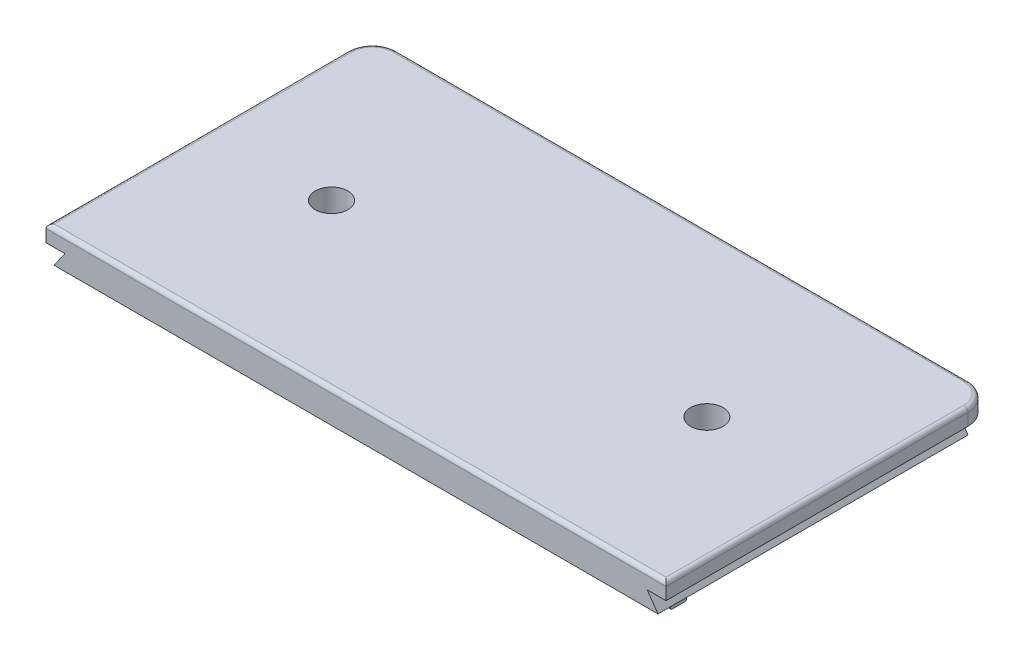
ISO-10303-21;
HEADER;
FILE_DESCRIPTION(('STEP AP214'),'2;1');
FILE_NAME('part.step','',(''),(''),'','','');
FILE_SCHEMA(('AUTOMOTIVE_DESIGN { 1 0 10303 214 1 1 1 1 }'));
ENDSEC;
DATA;
#1=APPLICATION_CONTEXT('core data for automotive mechanical design processes');
#2=APPLICATION_PROTOCOL_DEFINITION('international standard','automotive_design',2000,#1);
#3=PRODUCT_CONTEXT('',#1,'mechanical');
#4=PRODUCT('Part','Part','',(#3));
#5=PRODUCT_RELATED_PRODUCT_CATEGORY('part','',(#4));
#6=PRODUCT_DEFINITION_FORMATION('','',#4);
#7=PRODUCT_DEFINITION_CONTEXT('part definition',#1,'design');
#8=PRODUCT_DEFINITION('design','',#6,#7);
#9=PRODUCT_DEFINITION_SHAPE('','',#8);
#10=(LENGTH_UNIT() NAMED_UNIT(*) SI_UNIT(.MILLI.,.METRE.));
#11=(NAMED_UNIT(*) PLANE_ANGLE_UNIT() SI_UNIT($,.RADIAN.));
#12=(NAMED_UNIT(*) SI_UNIT($,.STERADIAN.) SOLID_ANGLE_UNIT());
#13=UNCERTAINTY_MEASURE_WITH_UNIT(LENGTH_MEASURE(1.E-05),#10,'distance_accuracy_value','');
#14=(GEOMETRIC_REPRESENTATION_CONTEXT(3) GLOBAL_UNCERTAINTY_ASSIGNED_CONTEXT((#13)) GLOBAL_UNIT_ASSIGNED_CONTEXT((#10,
#11,#12)) REPRESENTATION_CONTEXT('',''));
#15=CARTESIAN_POINT('',(0.,0.,0.));
#16=DIRECTION('',(0.,0.,1.));
#17=DIRECTION('',(1.,0.,0.));
#18=AXIS2_PLACEMENT_3D('',#15,#16,#17);
#19=CARTESIAN_POINT('',(37.0162186510252,22.2,-114.1));
#20=DIRECTION('',(0.,1.,0.));
#21=DIRECTION('',(-1.,0.,0.));
#22=AXIS2_PLACEMENT_3D('',#19,#20,#21);
#23=PLANE('',#22);
#24=CARTESIAN_POINT('',(23.,22.2,-20.));
#25=DIRECTION('',(0.,1.,0.));
#26=DIRECTION('',(-1.,0.,0.));
#27=AXIS2_PLACEMENT_3D('',#24,#25,#26);
#28=CIRCLE('',#27,2.);
#29=CARTESIAN_POINT('',(21.,22.2,-20.));
#30=VERTEX_POINT('',#29);
#31=EDGE_CURVE('E226',#30,#30,#28,.F.);
#32=ORIENTED_EDGE('',*,*,#31,.F.);
#33=EDGE_LOOP('',(#32));
#34=FACE_BOUND('',#33,.T.);
#35=CARTESIAN_POINT('',(-23.,22.2,-20.));
#36=DIRECTION('',(0.,1.,0.));
#37=DIRECTION('',(-1.,0.,0.));
#38=AXIS2_PLACEMENT_3D('',#35,#36,#37);
#39=CIRCLE('',#38,2.);
#40=CARTESIAN_POINT('',(-25.,22.2,-20.));
#41=VERTEX_POINT('',#40);
#42=EDGE_CURVE('E230',#41,#41,#39,.F.);
#43=ORIENTED_EDGE('',*,*,#42,.F.);
#44=EDGE_LOOP('',(#43));
#45=FACE_BOUND('',#44,.T.);
#46=DIRECTION('',(1.,0.,0.));
#47=VECTOR('',#46,1.);
#48=CARTESIAN_POINT('',(37.0162186510252,22.2,-3.5));
#49=LINE('',#48,#47);
#50=CARTESIAN_POINT('',(-37.0162186510252,22.2,-3.5));
#51=VERTEX_POINT('',#50);
#52=CARTESIAN_POINT('',(37.0162186510252,22.2,-3.5));
#53=VERTEX_POINT('',#52);
#54=EDGE_CURVE('E199',#51,#53,#49,.T.);
#55=ORIENTED_EDGE('',*,*,#54,.F.);
#56=DIRECTION('',(0.,0.,1.));
#57=VECTOR('',#56,1.);
#58=CARTESIAN_POINT('',(-37.0162186510252,22.2,-114.1));
#59=LINE('',#58,#57);
#60=CARTESIAN_POINT('',(-37.0162186510252,22.2,-38.));
#61=VERTEX_POINT('',#60);
#62=EDGE_CURVE('E198',#61,#51,#59,.T.);
#63=ORIENTED_EDGE('',*,*,#62,.F.);
#64=DIRECTION('',(-1.,0.,0.));
#65=VECTOR('',#64,1.);
#66=CARTESIAN_POINT('',(37.0162186510252,22.2,-38.));
#67=LINE('',#66,#65);
#68=CARTESIAN_POINT('',(37.0162186510252,22.2,-38.));
#69=VERTEX_POINT('',#68);
#70=EDGE_CURVE('E285',#69,#61,#67,.T.);
#71=ORIENTED_EDGE('',*,*,#70,.F.);
#72=DIRECTION('',(0.,0.,1.));
#73=VECTOR('',#72,1.);
#74=CARTESIAN_POINT('',(37.0162186510252,22.2,-114.1));
#75=LINE('',#74,#73);
#76=EDGE_CURVE('E261',#69,#53,#75,.T.);
#77=ORIENTED_EDGE('',*,*,#76,.T.);
#78=EDGE_LOOP('',(#55,#63,#71,#77));
#79=FACE_BOUND('',#78,.T.);
#80=ADVANCED_FACE('F39',(#34,#45,#79),#23,.F.);
#81=DIRECTION('',(-1.,0.,0.));
#82=VECTOR('',#81,1.);
#83=CARTESIAN_POINT('',(37.0162186510252,22.2,-1.5));
#84=LINE('',#83,#82);
#85=CARTESIAN_POINT('',(37.0162186510252,22.2,-1.5));
#86=VERTEX_POINT('',#85);
#87=CARTESIAN_POINT('',(-37.0162186510252,22.2,-1.50000000000001));
#88=VERTEX_POINT('',#87);
#89=EDGE_CURVE('E200',#86,#88,#84,.T.);
#90=ORIENTED_EDGE('',*,*,#89,.F.);
#91=CARTESIAN_POINT('',(37.0162186510252,22.2,0.));
#92=VERTEX_POINT('',#91);
#93=EDGE_CURVE('E265',#86,#92,#75,.T.);
#94=ORIENTED_EDGE('',*,*,#93,.T.);
#95=DIRECTION('',(-1.,0.,0.));
#96=VECTOR('',#95,1.);
#97=CARTESIAN_POINT('',(37.0162186510252,22.2,0.));
#98=LINE('',#97,#96);
#99=CARTESIAN_POINT('',(-37.0162186510252,22.2,0.));
#100=VERTEX_POINT('',#99);
#101=EDGE_CURVE('E207',#92,#100,#98,.T.);
#102=ORIENTED_EDGE('',*,*,#101,.T.);
#103=EDGE_CURVE('E195',#88,#100,#59,.T.);
#104=ORIENTED_EDGE('',*,*,#103,.F.);
#105=EDGE_LOOP('',(#90,#94,#102,#104));
#106=FACE_BOUND('',#105,.T.);
#107=ADVANCED_FACE('F204',(#106),#23,.F.);
#108=CARTESIAN_POINT('',(-38.,24.1,-114.1));
#109=DIRECTION('',(1.,0.,0.));
#110=DIRECTION('',(0.,0.,-1.));
#111=AXIS2_PLACEMENT_3D('',#108,#109,#110);
#112=PLANE('',#111);
#113=DIRECTION('',(0.,1.,0.));
#114=VECTOR('',#113,1.);
#115=CARTESIAN_POINT('',(-38.,24.1,0.));
#116=LINE('',#115,#114);
#117=CARTESIAN_POINT('',(-38.,24.1,0.));
#118=VERTEX_POINT('',#117);
#119=CARTESIAN_POINT('',(-38.,25.6,0.));
#120=VERTEX_POINT('',#119);
#121=EDGE_CURVE('E276',#118,#120,#116,.T.);
#122=ORIENTED_EDGE('',*,*,#121,.T.);
#123=DIRECTION('',(0.,0.,1.));
#124=VECTOR('',#123,1.);
#125=CARTESIAN_POINT('',(-38.,25.6,-114.1));
#126=LINE('',#125,#124);
#127=CARTESIAN_POINT('',(-38.,25.6,-37.));
#128=VERTEX_POINT('',#127);
#129=EDGE_CURVE('E335',#120,#128,#126,.F.);
#130=ORIENTED_EDGE('',*,*,#129,.T.);
#131=DIRECTION('',(0.,-1.,0.));
#132=VECTOR('',#131,1.);
#133=CARTESIAN_POINT('',(-38.,24.1,-37.));
#134=LINE('',#133,#132);
#135=CARTESIAN_POINT('',(-38.,24.1,-37.));
#136=VERTEX_POINT('',#135);
#137=EDGE_CURVE('E247',#128,#136,#134,.T.);
#138=ORIENTED_EDGE('',*,*,#137,.T.);
#139=DIRECTION('',(0.,0.,1.));
#140=VECTOR('',#139,1.);
#141=CARTESIAN_POINT('',(-38.,24.1,-114.1));
#142=LINE('',#141,#140);
#143=EDGE_CURVE('E242',#136,#118,#142,.T.);
#144=ORIENTED_EDGE('',*,*,#143,.T.);
#145=EDGE_LOOP('',(#122,#130,#138,#144));
#146=FACE_BOUND('',#145,.T.);
#147=ADVANCED_FACE('F414',(#146),#112,.F.);
#148=CARTESIAN_POINT('',(-38.,26.1,-114.1));
#149=DIRECTION('',(0.,-1.,0.));
#150=DIRECTION('',(0.,0.,-1.));
#151=AXIS2_PLACEMENT_3D('',#148,#149,#150);
#152=PLANE('',#151);
#153=CARTESIAN_POINT('',(-23.,26.1,-20.));
#154=DIRECTION('',(0.,1.,0.));
#155=DIRECTION('',(0.,0.,1.));
#156=AXIS2_PLACEMENT_3D('',#153,#154,#155);
#157=CIRCLE('',#156,2.);
#158=CARTESIAN_POINT('',(-23.,26.1,-18.));
#159=VERTEX_POINT('',#158);
#160=EDGE_CURVE('E227',#159,#159,#157,.T.);
#161=ORIENTED_EDGE('',*,*,#160,.F.);
#162=EDGE_LOOP('',(#161));
#163=FACE_BOUND('',#162,.T.);
#164=CARTESIAN_POINT('',(23.,26.1,-20.));
#165=DIRECTION('',(0.,1.,0.));
#166=DIRECTION('',(0.,0.,-1.));
#167=AXIS2_PLACEMENT_3D('',#164,#165,#166);
#168=CIRCLE('',#167,2.);
#169=CARTESIAN_POINT('',(23.,26.1,-22.));
#170=VERTEX_POINT('',#169);
#171=EDGE_CURVE('E231',#170,#170,#168,.T.);
#172=ORIENTED_EDGE('',*,*,#171,.F.);
#173=EDGE_LOOP('',(#172));
#174=FACE_BOUND('',#173,.T.);
#175=DIRECTION('',(0.,0.,1.));
#176=VECTOR('',#175,1.);
#177=CARTESIAN_POINT('',(37.5,26.1,-37.));
#178=LINE('',#177,#176);
#179=CARTESIAN_POINT('',(37.5,26.1,-0.5));
#180=VERTEX_POINT('',#179);
#181=CARTESIAN_POINT('',(37.5,26.1,-37.));
#182=VERTEX_POINT('',#181);
#183=EDGE_CURVE('E323',#180,#182,#178,.F.);
#184=ORIENTED_EDGE('',*,*,#183,.T.);
#185=CARTESIAN_POINT('',(35.,26.1,-37.));
#186=DIRECTION('',(0.,-1.,0.));
#187=DIRECTION('',(0.,0.,-1.));
#188=AXIS2_PLACEMENT_3D('',#185,#186,#187);
#189=CIRCLE('',#188,2.5);
#190=CARTESIAN_POINT('',(35.,26.1,-39.5));
#191=VERTEX_POINT('',#190);
#192=EDGE_CURVE('E325',#182,#191,#189,.F.);
#193=ORIENTED_EDGE('',*,*,#192,.T.);
#194=DIRECTION('',(-1.,0.,0.));
#195=VECTOR('',#194,1.);
#196=CARTESIAN_POINT('',(-38.,26.1,-39.5));
#197=LINE('',#196,#195);
#198=CARTESIAN_POINT('',(-35.,26.1,-39.5));
#199=VERTEX_POINT('',#198);
#200=EDGE_CURVE('E315',#191,#199,#197,.T.);
#201=ORIENTED_EDGE('',*,*,#200,.T.);
#202=CARTESIAN_POINT('',(-35.,26.1,-37.));
#203=DIRECTION('',(0.,-1.,0.));
#204=DIRECTION('',(0.,0.,-1.));
#205=AXIS2_PLACEMENT_3D('',#202,#203,#204);
#206=CIRCLE('',#205,2.5);
#207=CARTESIAN_POINT('',(-37.5,26.1,-37.));
#208=VERTEX_POINT('',#207);
#209=EDGE_CURVE('E317',#199,#208,#206,.F.);
#210=ORIENTED_EDGE('',*,*,#209,.T.);
#211=DIRECTION('',(0.,0.,1.));
#212=VECTOR('',#211,1.);
#213=CARTESIAN_POINT('',(-37.5,26.1,-114.1));
#214=LINE('',#213,#212);
#215=CARTESIAN_POINT('',(-37.5,26.1,-0.5));
#216=VERTEX_POINT('',#215);
#217=EDGE_CURVE('E319',#208,#216,#214,.T.);
#218=ORIENTED_EDGE('',*,*,#217,.T.);
#219=DIRECTION('',(1.,0.,0.));
#220=VECTOR('',#219,1.);
#221=CARTESIAN_POINT('',(-38.,26.1,-0.5));
#222=LINE('',#221,#220);
#223=EDGE_CURVE('E321',#216,#180,#222,.T.);
#224=ORIENTED_EDGE('',*,*,#223,.T.);
#225=EDGE_LOOP('',(#184,#193,#201,#210,#218,#224));
#226=FACE_BOUND('',#225,.T.);
#227=ADVANCED_FACE('F429',(#163,#174,#226),#152,.F.);
#228=CARTESIAN_POINT('',(38.,24.1,-114.1));
#229=DIRECTION('',(1.,0.,0.));
#230=DIRECTION('',(0.,0.,-1.));
#231=AXIS2_PLACEMENT_3D('',#228,#229,#230);
#232=PLANE('',#231);
#233=DIRECTION('',(0.,1.,0.));
#234=VECTOR('',#233,1.);
#235=CARTESIAN_POINT('',(38.,26.1,-37.));
#236=LINE('',#235,#234);
#237=CARTESIAN_POINT('',(38.,24.1,-37.));
#238=VERTEX_POINT('',#237);
#239=CARTESIAN_POINT('',(38.,25.6,-37.));
#240=VERTEX_POINT('',#239);
#241=EDGE_CURVE('E312',#238,#240,#236,.T.);
#242=ORIENTED_EDGE('',*,*,#241,.T.);
#243=DIRECTION('',(0.,0.,1.));
#244=VECTOR('',#243,1.);
#245=CARTESIAN_POINT('',(38.,25.6,0.));
#246=LINE('',#245,#244);
#247=CARTESIAN_POINT('',(38.,25.6,0.));
#248=VERTEX_POINT('',#247);
#249=EDGE_CURVE('E331',#240,#248,#246,.T.);
#250=ORIENTED_EDGE('',*,*,#249,.T.);
#251=DIRECTION('',(0.,1.,0.));
#252=VECTOR('',#251,1.);
#253=CARTESIAN_POINT('',(38.,24.1,0.));
#254=LINE('',#253,#252);
#255=CARTESIAN_POINT('',(38.,24.1,0.));
#256=VERTEX_POINT('',#255);
#257=EDGE_CURVE('E272',#256,#248,#254,.T.);
#258=ORIENTED_EDGE('',*,*,#257,.F.);
#259=DIRECTION('',(0.,0.,1.));
#260=VECTOR('',#259,1.);
#261=CARTESIAN_POINT('',(38.,24.1,-114.1));
#262=LINE('',#261,#260);
#263=EDGE_CURVE('E279',#238,#256,#262,.T.);
#264=ORIENTED_EDGE('',*,*,#263,.F.);
#265=EDGE_LOOP('',(#242,#250,#258,#264));
#266=FACE_BOUND('',#265,.T.);
#267=ADVANCED_FACE('F426',(#266),#232,.T.);
#268=CARTESIAN_POINT('',(35.7558450822477,24.1,-114.1));
#269=DIRECTION('',(0.,-1.,0.));
#270=DIRECTION('',(0.,0.,-1.));
#271=AXIS2_PLACEMENT_3D('',#268,#269,#270);
#272=PLANE('',#271);
#273=ORIENTED_EDGE('',*,*,#143,.F.);
#274=CARTESIAN_POINT('',(-35.,24.1,-37.));
#275=DIRECTION('',(0.,-1.,0.));
#276=DIRECTION('',(0.,0.,-1.));
#277=AXIS2_PLACEMENT_3D('',#274,#275,#276);
#278=CIRCLE('',#277,3.);
#279=CARTESIAN_POINT('',(-35.,24.1,-40.));
#280=VERTEX_POINT('',#279);
#281=EDGE_CURVE('E305',#136,#280,#278,.T.);
#282=ORIENTED_EDGE('',*,*,#281,.T.);
#283=DIRECTION('',(1.,0.,0.));
#284=VECTOR('',#283,1.);
#285=CARTESIAN_POINT('',(38.,24.1,-40.));
#286=LINE('',#285,#284);
#287=CARTESIAN_POINT('',(35.,24.1,-40.));
#288=VERTEX_POINT('',#287);
#289=EDGE_CURVE('E239',#280,#288,#286,.T.);
#290=ORIENTED_EDGE('',*,*,#289,.T.);
#291=CARTESIAN_POINT('',(35.,24.1,-37.));
#292=DIRECTION('',(0.,-1.,0.));
#293=DIRECTION('',(0.,0.,-1.));
#294=AXIS2_PLACEMENT_3D('',#291,#292,#293);
#295=CIRCLE('',#294,3.);
#296=EDGE_CURVE('E303',#288,#238,#295,.T.);
#297=ORIENTED_EDGE('',*,*,#296,.T.);
#298=ORIENTED_EDGE('',*,*,#263,.T.);
#299=DIRECTION('',(1.,0.,0.));
#300=VECTOR('',#299,1.);
#301=CARTESIAN_POINT('',(35.7558450822477,24.1,0.));
#302=LINE('',#301,#300);
#303=CARTESIAN_POINT('',(35.7558450822477,24.1,0.));
#304=VERTEX_POINT('',#303);
#305=EDGE_CURVE('E269',#304,#256,#302,.T.);
#306=ORIENTED_EDGE('',*,*,#305,.F.);
#307=DIRECTION('',(0.,0.,1.));
#308=VECTOR('',#307,1.);
#309=CARTESIAN_POINT('',(35.7558450822477,24.1,-114.1));
#310=LINE('',#309,#308);
#311=CARTESIAN_POINT('',(35.7558450822477,24.1,-38.));
#312=VERTEX_POINT('',#311);
#313=EDGE_CURVE('E293',#312,#304,#310,.T.);
#314=ORIENTED_EDGE('',*,*,#313,.F.);
#315=DIRECTION('',(-1.,0.,0.));
#316=VECTOR('',#315,1.);
#317=CARTESIAN_POINT('',(38.,24.1,-38.));
#318=LINE('',#317,#316);
#319=CARTESIAN_POINT('',(-35.7558450822477,24.1,-38.));
#320=VERTEX_POINT('',#319);
#321=EDGE_CURVE('E244',#312,#320,#318,.T.);
#322=ORIENTED_EDGE('',*,*,#321,.T.);
#323=DIRECTION('',(0.,0.,1.));
#324=VECTOR('',#323,1.);
#325=CARTESIAN_POINT('',(-35.7558450822477,24.1,-114.1));
#326=LINE('',#325,#324);
#327=CARTESIAN_POINT('',(-35.7558450822477,24.1,0.));
#328=VERTEX_POINT('',#327);
#329=EDGE_CURVE('E253',#320,#328,#326,.T.);
#330=ORIENTED_EDGE('',*,*,#329,.T.);
#331=DIRECTION('',(-1.,0.,0.));
#332=VECTOR('',#331,1.);
#333=CARTESIAN_POINT('',(-35.7558450822477,24.1,0.));
#334=LINE('',#333,#332);
#335=EDGE_CURVE('E249',#328,#118,#334,.T.);
#336=ORIENTED_EDGE('',*,*,#335,.T.);
#337=EDGE_LOOP('',(#273,#282,#290,#297,#298,#306,#314,#322,#330,#336));
#338=FACE_BOUND('',#337,.T.);
#339=ADVANCED_FACE('F396',(#338),#272,.T.);
#340=CARTESIAN_POINT('',(35.7558450822477,24.,-114.1));
#341=DIRECTION('',(1.,0.,0.));
#342=DIRECTION('',(0.,0.,-1.));
#343=AXIS2_PLACEMENT_3D('',#340,#341,#342);
#344=PLANE('',#343);
#345=DIRECTION('',(0.,0.,1.));
#346=VECTOR('',#345,1.);
#347=CARTESIAN_POINT('',(35.7558450822477,24.,-114.1));
#348=LINE('',#347,#346);
#349=CARTESIAN_POINT('',(35.7558450822477,24.,-38.));
#350=VERTEX_POINT('',#349);
#351=CARTESIAN_POINT('',(35.7558450822477,24.,0.));
#352=VERTEX_POINT('',#351);
#353=EDGE_CURVE('E266',#350,#352,#348,.T.);
#354=ORIENTED_EDGE('',*,*,#353,.F.);
#355=DIRECTION('',(0.,1.,0.));
#356=VECTOR('',#355,1.);
#357=CARTESIAN_POINT('',(35.7558450822477,24.,-38.));
#358=LINE('',#357,#356);
#359=EDGE_CURVE('E290',#350,#312,#358,.T.);
#360=ORIENTED_EDGE('',*,*,#359,.T.);
#361=ORIENTED_EDGE('',*,*,#313,.T.);
#362=DIRECTION('',(0.,1.,0.));
#363=VECTOR('',#362,1.);
#364=CARTESIAN_POINT('',(35.7558450822477,24.,0.));
#365=LINE('',#364,#363);
#366=EDGE_CURVE('E252',#352,#304,#365,.T.);
#367=ORIENTED_EDGE('',*,*,#366,.F.);
#368=EDGE_LOOP('',(#354,#360,#361,#367));
#369=FACE_BOUND('',#368,.T.);
#370=ADVANCED_FACE('F391',(#369),#344,.T.);
#371=CARTESIAN_POINT('',(35.7558450822477,24.,-114.1));
#372=DIRECTION('',(-0.819152044288989,-0.57357643635105,0.));
#373=DIRECTION('',(0.57357643635105,-0.819152044288989,0.));
#374=AXIS2_PLACEMENT_3D('',#371,#372,#373);
#375=PLANE('',#374);
#376=DIRECTION('',(0.57357643635105,-0.819152044288989,0.));
#377=VECTOR('',#376,1.);
#378=CARTESIAN_POINT('',(35.7558450822477,24.,-38.));
#379=LINE('',#378,#377);
#380=EDGE_CURVE('E275',#350,#69,#379,.T.);
#381=ORIENTED_EDGE('',*,*,#380,.F.);
#382=ORIENTED_EDGE('',*,*,#353,.T.);
#383=DIRECTION('',(0.57357643635105,-0.819152044288989,0.));
#384=VECTOR('',#383,1.);
#385=CARTESIAN_POINT('',(35.7558450822477,24.,0.));
#386=LINE('',#385,#384);
#387=EDGE_CURVE('E262',#352,#92,#386,.T.);
#388=ORIENTED_EDGE('',*,*,#387,.T.);
#389=ORIENTED_EDGE('',*,*,#93,.F.);
#390=DIRECTION('',(0.,0.,1.));
#391=VECTOR('',#390,1.);
#392=CARTESIAN_POINT('',(37.0162186510252,22.2,-1.5));
#393=LINE('',#392,#391);
#394=EDGE_CURVE('E212',#53,#86,#393,.T.);
#395=ORIENTED_EDGE('',*,*,#394,.F.);
#396=ORIENTED_EDGE('',*,*,#76,.F.);
#397=EDGE_LOOP('',(#381,#382,#388,#389,#395,#396));
#398=FACE_BOUND('',#397,.T.);
#399=ADVANCED_FACE('F384',(#398),#375,.F.);
#400=CARTESIAN_POINT('',(-37.0162186510252,22.2,-114.1));
#401=DIRECTION('',(0.819152044288988,-0.573576436351052,0.));
#402=DIRECTION('',(0.573576436351052,0.819152044288988,0.));
#403=AXIS2_PLACEMENT_3D('',#400,#401,#402);
#404=PLANE('',#403);
#405=DIRECTION('',(0.573576436351052,0.819152044288988,0.));
#406=VECTOR('',#405,1.);
#407=CARTESIAN_POINT('',(-37.0162186510252,22.2,-38.));
#408=LINE('',#407,#406);
#409=CARTESIAN_POINT('',(-35.7558450822477,24.,-38.));
#410=VERTEX_POINT('',#409);
#411=EDGE_CURVE('E282',#61,#410,#408,.T.);
#412=ORIENTED_EDGE('',*,*,#411,.F.);
#413=ORIENTED_EDGE('',*,*,#62,.T.);
#414=DIRECTION('',(0.,0.,-1.));
#415=VECTOR('',#414,1.);
#416=CARTESIAN_POINT('',(-37.0162186510252,22.2,-1.50000000000001));
#417=LINE('',#416,#415);
#418=EDGE_CURVE('E183',#88,#51,#417,.T.);
#419=ORIENTED_EDGE('',*,*,#418,.F.);
#420=ORIENTED_EDGE('',*,*,#103,.T.);
#421=DIRECTION('',(0.573576436351052,0.819152044288988,0.));
#422=VECTOR('',#421,1.);
#423=CARTESIAN_POINT('',(-37.0162186510252,22.2,0.));
#424=LINE('',#423,#422);
#425=CARTESIAN_POINT('',(-35.7558450822477,24.,0.));
#426=VERTEX_POINT('',#425);
#427=EDGE_CURVE('E258',#100,#426,#424,.T.);
#428=ORIENTED_EDGE('',*,*,#427,.T.);
#429=DIRECTION('',(0.,0.,1.));
#430=VECTOR('',#429,1.);
#431=CARTESIAN_POINT('',(-35.7558450822477,24.,-114.1));
#432=LINE('',#431,#430);
#433=EDGE_CURVE('E257',#410,#426,#432,.T.);
#434=ORIENTED_EDGE('',*,*,#433,.F.);
#435=EDGE_LOOP('',(#412,#413,#419,#420,#428,#434));
#436=FACE_BOUND('',#435,.T.);
#437=ADVANCED_FACE('F193',(#436),#404,.F.);
#438=CARTESIAN_POINT('',(-35.7558450822477,24.,-114.1));
#439=DIRECTION('',(1.,0.,0.));
#440=DIRECTION('',(0.,0.,-1.));
#441=AXIS2_PLACEMENT_3D('',#438,#439,#440);
#442=PLANE('',#441);
#443=DIRECTION('',(0.,1.,0.));
#444=VECTOR('',#443,1.);
#445=CARTESIAN_POINT('',(-35.7558450822477,24.,-38.));
#446=LINE('',#445,#444);
#447=EDGE_CURVE('E248',#410,#320,#446,.T.);
#448=ORIENTED_EDGE('',*,*,#447,.F.);
#449=ORIENTED_EDGE('',*,*,#433,.T.);
#450=DIRECTION('',(0.,1.,0.));
#451=VECTOR('',#450,1.);
#452=CARTESIAN_POINT('',(-35.7558450822477,24.,0.));
#453=LINE('',#452,#451);
#454=EDGE_CURVE('E254',#426,#328,#453,.T.);
#455=ORIENTED_EDGE('',*,*,#454,.T.);
#456=ORIENTED_EDGE('',*,*,#329,.F.);
#457=EDGE_LOOP('',(#448,#449,#455,#456));
#458=FACE_BOUND('',#457,.T.);
#459=ADVANCED_FACE('F505',(#458),#442,.F.);
#460=CARTESIAN_POINT('',(0.,0.,0.));
#461=DIRECTION('',(0.,0.,-1.));
#462=DIRECTION('',(-1.,0.,0.));
#463=AXIS2_PLACEMENT_3D('',#460,#461,#462);
#464=PLANE('',#463);
#465=ORIENTED_EDGE('',*,*,#257,.T.);
#466=DIRECTION('',(1.,0.,0.));
#467=VECTOR('',#466,1.);
#468=CARTESIAN_POINT('',(0.,25.6,0.));
#469=LINE('',#468,#467);
#470=EDGE_CURVE('E333',#248,#120,#469,.F.);
#471=ORIENTED_EDGE('',*,*,#470,.T.);
#472=ORIENTED_EDGE('',*,*,#121,.F.);
#473=ORIENTED_EDGE('',*,*,#335,.F.);
#474=ORIENTED_EDGE('',*,*,#454,.F.);
#475=ORIENTED_EDGE('',*,*,#427,.F.);
#476=ORIENTED_EDGE('',*,*,#101,.F.);
#477=ORIENTED_EDGE('',*,*,#387,.F.);
#478=ORIENTED_EDGE('',*,*,#366,.T.);
#479=ORIENTED_EDGE('',*,*,#305,.T.);
#480=EDGE_LOOP('',(#465,#471,#472,#473,#474,#475,#476,#477,#478,#479));
#481=FACE_BOUND('',#480,.T.);
#482=ADVANCED_FACE('F401',(#481),#464,.F.);
#483=CARTESIAN_POINT('',(-38.,100.026311234993,-38.));
#484=DIRECTION('',(0.,0.,-1.));
#485=DIRECTION('',(-1.,0.,0.));
#486=AXIS2_PLACEMENT_3D('',#483,#484,#485);
#487=PLANE('',#486);
#488=ORIENTED_EDGE('',*,*,#321,.F.);
#489=ORIENTED_EDGE('',*,*,#359,.F.);
#490=ORIENTED_EDGE('',*,*,#380,.T.);
#491=ORIENTED_EDGE('',*,*,#70,.T.);
#492=ORIENTED_EDGE('',*,*,#411,.T.);
#493=ORIENTED_EDGE('',*,*,#447,.T.);
#494=EDGE_LOOP('',(#488,#489,#490,#491,#492,#493));
#495=FACE_BOUND('',#494,.T.);
#496=ADVANCED_FACE('F388',(#495),#487,.T.);
#497=CARTESIAN_POINT('',(48.3481292653237,24.,-40.));
#498=DIRECTION('',(0.,0.,1.));
#499=DIRECTION('',(1.,0.,0.));
#500=AXIS2_PLACEMENT_3D('',#497,#498,#499);
#501=PLANE('',#500);
#502=DIRECTION('',(0.,-1.,0.));
#503=VECTOR('',#502,1.);
#504=CARTESIAN_POINT('',(-35.,24.,-40.));
#505=LINE('',#504,#503);
#506=CARTESIAN_POINT('',(-35.,25.6,-40.));
#507=VERTEX_POINT('',#506);
#508=EDGE_CURVE('E309',#280,#507,#505,.F.);
#509=ORIENTED_EDGE('',*,*,#508,.T.);
#510=DIRECTION('',(-1.,0.,0.));
#511=VECTOR('',#510,1.);
#512=CARTESIAN_POINT('',(48.3481292653237,25.6,-40.));
#513=LINE('',#512,#511);
#514=CARTESIAN_POINT('',(35.,25.6,-40.));
#515=VERTEX_POINT('',#514);
#516=EDGE_CURVE('E339',#507,#515,#513,.F.);
#517=ORIENTED_EDGE('',*,*,#516,.T.);
#518=DIRECTION('',(0.,1.,0.));
#519=VECTOR('',#518,1.);
#520=CARTESIAN_POINT('',(35.,24.1,-40.));
#521=LINE('',#520,#519);
#522=EDGE_CURVE('E307',#515,#288,#521,.F.);
#523=ORIENTED_EDGE('',*,*,#522,.T.);
#524=ORIENTED_EDGE('',*,*,#289,.F.);
#525=EDGE_LOOP('',(#509,#517,#523,#524));
#526=FACE_BOUND('',#525,.T.);
#527=ADVANCED_FACE('F439',(#526),#501,.F.);
#528=CARTESIAN_POINT('',(-35.,24.1,-37.));
#529=DIRECTION('',(0.,-1.,0.));
#530=DIRECTION('',(0.,0.,-1.));
#531=AXIS2_PLACEMENT_3D('',#528,#529,#530);
#532=CYLINDRICAL_SURFACE('',#531,3.);
#533=ORIENTED_EDGE('',*,*,#137,.F.);
#534=CARTESIAN_POINT('',(-35.,25.6,-37.));
#535=DIRECTION('',(0.,-1.,0.));
#536=DIRECTION('',(0.,0.,-1.));
#537=AXIS2_PLACEMENT_3D('',#534,#535,#536);
#538=CIRCLE('',#537,3.);
#539=EDGE_CURVE('E337',#128,#507,#538,.T.);
#540=ORIENTED_EDGE('',*,*,#539,.T.);
#541=ORIENTED_EDGE('',*,*,#508,.F.);
#542=ORIENTED_EDGE('',*,*,#281,.F.);
#543=EDGE_LOOP('',(#533,#540,#541,#542));
#544=FACE_BOUND('',#543,.T.);
#545=ADVANCED_FACE('F440',(#544),#532,.T.);
#546=CARTESIAN_POINT('',(35.,24.1,-37.));
#547=DIRECTION('',(0.,-1.,0.));
#548=DIRECTION('',(0.,0.,-1.));
#549=AXIS2_PLACEMENT_3D('',#546,#547,#548);
#550=CYLINDRICAL_SURFACE('',#549,3.);
#551=ORIENTED_EDGE('',*,*,#522,.F.);
#552=CARTESIAN_POINT('',(35.,25.6,-37.));
#553=DIRECTION('',(0.,-1.,0.));
#554=DIRECTION('',(0.,0.,-1.));
#555=AXIS2_PLACEMENT_3D('',#552,#553,#554);
#556=CIRCLE('',#555,3.);
#557=EDGE_CURVE('E328',#515,#240,#556,.T.);
#558=ORIENTED_EDGE('',*,*,#557,.T.);
#559=ORIENTED_EDGE('',*,*,#241,.F.);
#560=ORIENTED_EDGE('',*,*,#296,.F.);
#561=EDGE_LOOP('',(#551,#558,#559,#560));
#562=FACE_BOUND('',#561,.T.);
#563=ADVANCED_FACE('F443',(#562),#550,.T.);
#564=CARTESIAN_POINT('',(-37.5,25.6,-114.1));
#565=DIRECTION('',(0.,0.,1.));
#566=DIRECTION('',(1.,0.,0.));
#567=AXIS2_PLACEMENT_3D('',#564,#565,#566);
#568=CYLINDRICAL_SURFACE('',#567,0.5);
#569=CARTESIAN_POINT('',(-37.5,25.6,-37.));
#570=DIRECTION('',(0.,0.,-1.));
#571=DIRECTION('',(-1.,0.,0.));
#572=AXIS2_PLACEMENT_3D('',#569,#570,#571);
#573=CIRCLE('',#572,0.5);
#574=EDGE_CURVE('E351',#128,#208,#573,.T.);
#575=ORIENTED_EDGE('',*,*,#574,.F.);
#576=ORIENTED_EDGE('',*,*,#129,.F.);
#577=CARTESIAN_POINT('',(-37.5,25.6,-0.5));
#578=DIRECTION('',(0.707106781186547,0.,0.707106781186547));
#579=DIRECTION('',(-0.707106781186547,0.,0.707106781186547));
#580=AXIS2_PLACEMENT_3D('',#577,#578,#579);
#581=ELLIPSE('',#580,0.707106781186547,0.5);
#582=EDGE_CURVE('E243',#216,#120,#581,.T.);
#583=ORIENTED_EDGE('',*,*,#582,.F.);
#584=ORIENTED_EDGE('',*,*,#217,.F.);
#585=EDGE_LOOP('',(#575,#576,#583,#584));
#586=FACE_BOUND('',#585,.T.);
#587=ADVANCED_FACE('F447',(#586),#568,.T.);
#588=CARTESIAN_POINT('',(-38.,25.6,-0.5));
#589=DIRECTION('',(1.,0.,0.));
#590=DIRECTION('',(0.,0.,-1.));
#591=AXIS2_PLACEMENT_3D('',#588,#589,#590);
#592=CYLINDRICAL_SURFACE('',#591,0.5);
#593=ORIENTED_EDGE('',*,*,#582,.T.);
#594=ORIENTED_EDGE('',*,*,#470,.F.);
#595=CARTESIAN_POINT('',(37.5,25.6,-0.5));
#596=DIRECTION('',(0.707106781186547,0.,-0.707106781186547));
#597=DIRECTION('',(0.707106781186547,0.,0.707106781186547));
#598=AXIS2_PLACEMENT_3D('',#595,#596,#597);
#599=ELLIPSE('',#598,0.707106781186547,0.5);
#600=EDGE_CURVE('E348',#180,#248,#599,.T.);
#601=ORIENTED_EDGE('',*,*,#600,.F.);
#602=ORIENTED_EDGE('',*,*,#223,.F.);
#603=EDGE_LOOP('',(#593,#594,#601,#602));
#604=FACE_BOUND('',#603,.T.);
#605=ADVANCED_FACE('F465',(#604),#592,.T.);
#606=CARTESIAN_POINT('',(-35.,25.6,-37.));
#607=DIRECTION('',(0.,-1.,0.));
#608=DIRECTION('',(0.,0.,-1.));
#609=AXIS2_PLACEMENT_3D('',#606,#607,#608);
#610=TOROIDAL_SURFACE('',#609,2.5,0.5);
#611=ORIENTED_EDGE('',*,*,#574,.T.);
#612=ORIENTED_EDGE('',*,*,#209,.F.);
#613=CARTESIAN_POINT('',(-35.,25.6,-39.5));
#614=DIRECTION('',(1.,0.,0.));
#615=DIRECTION('',(0.,0.,-1.));
#616=AXIS2_PLACEMENT_3D('',#613,#614,#615);
#617=CIRCLE('',#616,0.5);
#618=EDGE_CURVE('E345',#507,#199,#617,.T.);
#619=ORIENTED_EDGE('',*,*,#618,.F.);
#620=ORIENTED_EDGE('',*,*,#539,.F.);
#621=EDGE_LOOP('',(#611,#612,#619,#620));
#622=FACE_BOUND('',#621,.T.);
#623=ADVANCED_FACE('F461',(#622),#610,.T.);
#624=CARTESIAN_POINT('',(37.5,25.6,-114.1));
#625=DIRECTION('',(0.,0.,-1.));
#626=DIRECTION('',(-1.,0.,0.));
#627=AXIS2_PLACEMENT_3D('',#624,#625,#626);
#628=CYLINDRICAL_SURFACE('',#627,0.5);
#629=ORIENTED_EDGE('',*,*,#600,.T.);
#630=ORIENTED_EDGE('',*,*,#249,.F.);
#631=CARTESIAN_POINT('',(37.5,25.6,-37.));
#632=DIRECTION('',(0.,0.,-1.));
#633=DIRECTION('',(-1.,0.,0.));
#634=AXIS2_PLACEMENT_3D('',#631,#632,#633);
#635=CIRCLE('',#634,0.5);
#636=EDGE_CURVE('E343',#182,#240,#635,.T.);
#637=ORIENTED_EDGE('',*,*,#636,.F.);
#638=ORIENTED_EDGE('',*,*,#183,.F.);
#639=EDGE_LOOP('',(#629,#630,#637,#638));
#640=FACE_BOUND('',#639,.T.);
#641=ADVANCED_FACE('F457',(#640),#628,.T.);
#642=CARTESIAN_POINT('',(-38.,25.6,-39.5));
#643=DIRECTION('',(-1.,0.,0.));
#644=DIRECTION('',(0.,0.,1.));
#645=AXIS2_PLACEMENT_3D('',#642,#643,#644);
#646=CYLINDRICAL_SURFACE('',#645,0.5);
#647=ORIENTED_EDGE('',*,*,#618,.T.);
#648=ORIENTED_EDGE('',*,*,#200,.F.);
#649=CARTESIAN_POINT('',(35.,25.6,-39.5));
#650=DIRECTION('',(1.,0.,0.));
#651=DIRECTION('',(0.,0.,-1.));
#652=AXIS2_PLACEMENT_3D('',#649,#650,#651);
#653=CIRCLE('',#652,0.5);
#654=EDGE_CURVE('E234',#515,#191,#653,.T.);
#655=ORIENTED_EDGE('',*,*,#654,.F.);
#656=ORIENTED_EDGE('',*,*,#516,.F.);
#657=EDGE_LOOP('',(#647,#648,#655,#656));
#658=FACE_BOUND('',#657,.T.);
#659=ADVANCED_FACE('F453',(#658),#646,.T.);
#660=CARTESIAN_POINT('',(35.,25.6,-37.));
#661=DIRECTION('',(0.,-1.,0.));
#662=DIRECTION('',(0.,0.,-1.));
#663=AXIS2_PLACEMENT_3D('',#660,#661,#662);
#664=TOROIDAL_SURFACE('',#663,2.5,0.5);
#665=ORIENTED_EDGE('',*,*,#636,.T.);
#666=ORIENTED_EDGE('',*,*,#557,.F.);
#667=ORIENTED_EDGE('',*,*,#654,.T.);
#668=ORIENTED_EDGE('',*,*,#192,.F.);
#669=EDGE_LOOP('',(#665,#666,#667,#668));
#670=FACE_BOUND('',#669,.T.);
#671=ADVANCED_FACE('F449',(#670),#664,.T.);
#672=CARTESIAN_POINT('',(23.,22.199,-20.));
#673=DIRECTION('',(0.,1.,0.));
#674=DIRECTION('',(0.,0.,1.));
#675=AXIS2_PLACEMENT_3D('',#672,#673,#674);
#676=CYLINDRICAL_SURFACE('',#675,2.);
#677=ORIENTED_EDGE('',*,*,#171,.T.);
#678=EDGE_LOOP('',(#677));
#679=FACE_BOUND('',#678,.T.);
#680=ORIENTED_EDGE('',*,*,#31,.T.);
#681=EDGE_LOOP('',(#680));
#682=FACE_BOUND('',#681,.T.);
#683=ADVANCED_FACE('F452',(#679,#682),#676,.F.);
#684=CARTESIAN_POINT('',(-23.,22.199,-20.));
#685=DIRECTION('',(0.,1.,0.));
#686=DIRECTION('',(0.,0.,1.));
#687=AXIS2_PLACEMENT_3D('',#684,#685,#686);
#688=CYLINDRICAL_SURFACE('',#687,2.);
#689=ORIENTED_EDGE('',*,*,#160,.T.);
#690=EDGE_LOOP('',(#689));
#691=FACE_BOUND('',#690,.T.);
#692=ORIENTED_EDGE('',*,*,#42,.T.);
#693=EDGE_LOOP('',(#692));
#694=FACE_BOUND('',#693,.T.);
#695=ADVANCED_FACE('F518',(#691,#694),#688,.F.);
#696=CARTESIAN_POINT('',(37.0162186510252,21.85,-1.5));
#697=DIRECTION('',(-1.,0.,0.));
#698=DIRECTION('',(0.,0.,1.));
#699=AXIS2_PLACEMENT_3D('',#696,#697,#698);
#700=PLANE('',#699);
#701=DIRECTION('',(0.,0.,1.));
#702=VECTOR('',#701,1.);
#703=CARTESIAN_POINT('',(37.0162186510252,21.85,-1.5));
#704=LINE('',#703,#702);
#705=CARTESIAN_POINT('',(37.0162186510252,21.85,-3.25));
#706=VERTEX_POINT('',#705);
#707=CARTESIAN_POINT('',(37.0162186510252,21.85,-1.75));
#708=VERTEX_POINT('',#707);
#709=EDGE_CURVE('E220',#706,#708,#704,.T.);
#710=ORIENTED_EDGE('',*,*,#709,.F.);
#711=CARTESIAN_POINT('',(37.0162186510252,22.1,-3.25));
#712=DIRECTION('',(-1.,0.,0.));
#713=DIRECTION('',(0.,0.,1.));
#714=AXIS2_PLACEMENT_3D('',#711,#712,#713);
#715=CIRCLE('',#714,0.25);
#716=CARTESIAN_POINT('',(37.0162186510252,22.1,-3.5));
#717=VERTEX_POINT('',#716);
#718=EDGE_CURVE('E363',#706,#717,#715,.F.);
#719=ORIENTED_EDGE('',*,*,#718,.T.);
#720=DIRECTION('',(0.,1.,0.));
#721=VECTOR('',#720,1.);
#722=CARTESIAN_POINT('',(37.0162186510252,21.85,-3.5));
#723=LINE('',#722,#721);
#724=EDGE_CURVE('E221',#717,#53,#723,.T.);
#725=ORIENTED_EDGE('',*,*,#724,.T.);
#726=ORIENTED_EDGE('',*,*,#394,.T.);
#727=DIRECTION('',(0.,1.,0.));
#728=VECTOR('',#727,1.);
#729=CARTESIAN_POINT('',(37.0162186510252,21.85,-1.5));
#730=LINE('',#729,#728);
#731=CARTESIAN_POINT('',(37.0162186510252,22.1,-1.5));
#732=VERTEX_POINT('',#731);
#733=EDGE_CURVE('E187',#732,#86,#730,.T.);
#734=ORIENTED_EDGE('',*,*,#733,.F.);
#735=CARTESIAN_POINT('',(37.0162186510252,22.1,-1.75));
#736=DIRECTION('',(-1.,0.,0.));
#737=DIRECTION('',(0.,0.,1.));
#738=AXIS2_PLACEMENT_3D('',#735,#736,#737);
#739=CIRCLE('',#738,0.25);
#740=EDGE_CURVE('E361',#732,#708,#739,.F.);
#741=ORIENTED_EDGE('',*,*,#740,.T.);
#742=EDGE_LOOP('',(#710,#719,#725,#726,#734,#741));
#743=FACE_BOUND('',#742,.T.);
#744=ADVANCED_FACE('F377',(#743),#700,.F.);
#745=CARTESIAN_POINT('',(37.0162186510252,21.85,-1.5));
#746=DIRECTION('',(0.,0.,-1.));
#747=DIRECTION('',(-1.,0.,0.));
#748=AXIS2_PLACEMENT_3D('',#745,#746,#747);
#749=PLANE('',#748);
#750=DIRECTION('',(0.,1.,0.));
#751=VECTOR('',#750,1.);
#752=CARTESIAN_POINT('',(-37.0162186510252,21.85,-1.50000000000001));
#753=LINE('',#752,#751);
#754=CARTESIAN_POINT('',(-37.0162186510252,22.1,-1.50000000000001));
#755=VERTEX_POINT('',#754);
#756=EDGE_CURVE('E180',#755,#88,#753,.T.);
#757=ORIENTED_EDGE('',*,*,#756,.F.);
#758=DIRECTION('',(-1.,0.,0.));
#759=VECTOR('',#758,1.);
#760=CARTESIAN_POINT('',(37.0162186510252,22.1,-1.5));
#761=LINE('',#760,#759);
#762=EDGE_CURVE('E11',#755,#732,#761,.F.);
#763=ORIENTED_EDGE('',*,*,#762,.T.);
#764=ORIENTED_EDGE('',*,*,#733,.T.);
#765=ORIENTED_EDGE('',*,*,#89,.T.);
#766=EDGE_LOOP('',(#757,#763,#764,#765));
#767=FACE_BOUND('',#766,.T.);
#768=ADVANCED_FACE('F210',(#767),#749,.F.);
#769=CARTESIAN_POINT('',(-37.0162186510252,21.85,-1.50000000000001));
#770=DIRECTION('',(1.,0.,0.));
#771=DIRECTION('',(0.,0.,-1.));
#772=AXIS2_PLACEMENT_3D('',#769,#770,#771);
#773=PLANE('',#772);
#774=DIRECTION('',(0.,1.,0.));
#775=VECTOR('',#774,1.);
#776=CARTESIAN_POINT('',(-37.0162186510252,21.85,-3.50000000000001));
#777=LINE('',#776,#775);
#778=CARTESIAN_POINT('',(-37.0162186510252,22.1,-3.50000000000001));
#779=VERTEX_POINT('',#778);
#780=EDGE_CURVE('E188',#779,#51,#777,.T.);
#781=ORIENTED_EDGE('',*,*,#780,.F.);
#782=CARTESIAN_POINT('',(-37.0162186510252,22.1,-3.25000000000001));
#783=DIRECTION('',(1.,0.,0.));
#784=DIRECTION('',(0.,0.,-1.));
#785=AXIS2_PLACEMENT_3D('',#782,#783,#784);
#786=CIRCLE('',#785,0.25);
#787=CARTESIAN_POINT('',(-37.0162186510252,21.85,-3.25000000000001));
#788=VERTEX_POINT('',#787);
#789=EDGE_CURVE('E47',#779,#788,#786,.F.);
#790=ORIENTED_EDGE('',*,*,#789,.T.);
#791=DIRECTION('',(0.,0.,-1.));
#792=VECTOR('',#791,1.);
#793=CARTESIAN_POINT('',(-37.0162186510252,21.85,-1.50000000000001));
#794=LINE('',#793,#792);
#795=CARTESIAN_POINT('',(-37.0162186510252,21.85,-1.75000000000001));
#796=VERTEX_POINT('',#795);
#797=EDGE_CURVE('E223',#796,#788,#794,.T.);
#798=ORIENTED_EDGE('',*,*,#797,.F.);
#799=CARTESIAN_POINT('',(-37.0162186510252,22.1,-1.75000000000001));
#800=DIRECTION('',(1.,0.,0.));
#801=DIRECTION('',(0.,0.,-1.));
#802=AXIS2_PLACEMENT_3D('',#799,#800,#801);
#803=CIRCLE('',#802,0.25);
#804=EDGE_CURVE('E54',#796,#755,#803,.F.);
#805=ORIENTED_EDGE('',*,*,#804,.T.);
#806=ORIENTED_EDGE('',*,*,#756,.T.);
#807=ORIENTED_EDGE('',*,*,#418,.T.);
#808=EDGE_LOOP('',(#781,#790,#798,#805,#806,#807));
#809=FACE_BOUND('',#808,.T.);
#810=ADVANCED_FACE('F182',(#809),#773,.F.);
#811=CARTESIAN_POINT('',(37.0162186510252,21.85,-3.5));
#812=DIRECTION('',(0.,0.,1.));
#813=DIRECTION('',(1.,0.,0.));
#814=AXIS2_PLACEMENT_3D('',#811,#812,#813);
#815=PLANE('',#814);
#816=ORIENTED_EDGE('',*,*,#724,.F.);
#817=DIRECTION('',(1.,0.,0.));
#818=VECTOR('',#817,1.);
#819=CARTESIAN_POINT('',(37.0162186510252,22.1,-3.5));
#820=LINE('',#819,#818);
#821=EDGE_CURVE('E62',#717,#779,#820,.F.);
#822=ORIENTED_EDGE('',*,*,#821,.T.);
#823=ORIENTED_EDGE('',*,*,#780,.T.);
#824=ORIENTED_EDGE('',*,*,#54,.T.);
#825=EDGE_LOOP('',(#816,#822,#823,#824));
#826=FACE_BOUND('',#825,.T.);
#827=ADVANCED_FACE('F379',(#826),#815,.F.);
#828=CARTESIAN_POINT('',(0.,21.85,0.));
#829=DIRECTION('',(0.,1.,0.));
#830=DIRECTION('',(0.,0.,1.));
#831=AXIS2_PLACEMENT_3D('',#828,#829,#830);
#832=PLANE('',#831);
#833=ORIENTED_EDGE('',*,*,#797,.T.);
#834=DIRECTION('',(1.,0.,0.));
#835=VECTOR('',#834,1.);
#836=CARTESIAN_POINT('',(0.,21.85,-3.25000000000001));
#837=LINE('',#836,#835);
#838=EDGE_CURVE('E358',#788,#706,#837,.T.);
#839=ORIENTED_EDGE('',*,*,#838,.T.);
#840=ORIENTED_EDGE('',*,*,#709,.T.);
#841=DIRECTION('',(-1.,0.,0.));
#842=VECTOR('',#841,1.);
#843=CARTESIAN_POINT('',(0.,21.85,-1.75000000000001));
#844=LINE('',#843,#842);
#845=EDGE_CURVE('E341',#708,#796,#844,.T.);
#846=ORIENTED_EDGE('',*,*,#845,.T.);
#847=EDGE_LOOP('',(#833,#839,#840,#846));
#848=FACE_BOUND('',#847,.T.);
#849=ADVANCED_FACE('F371',(#848),#832,.F.);
#850=CARTESIAN_POINT('',(0.,22.1,-3.25000000000001));
#851=DIRECTION('',(1.,0.,0.));
#852=DIRECTION('',(0.,0.,-1.));
#853=AXIS2_PLACEMENT_3D('',#850,#851,#852);
#854=CYLINDRICAL_SURFACE('',#853,0.25);
#855=ORIENTED_EDGE('',*,*,#789,.F.);
#856=ORIENTED_EDGE('',*,*,#821,.F.);
#857=ORIENTED_EDGE('',*,*,#718,.F.);
#858=ORIENTED_EDGE('',*,*,#838,.F.);
#859=EDGE_LOOP('',(#855,#856,#857,#858));
#860=FACE_BOUND('',#859,.T.);
#861=ADVANCED_FACE('F375',(#860),#854,.T.);
#862=CARTESIAN_POINT('',(0.,22.1,-1.75000000000001));
#863=DIRECTION('',(-1.,0.,0.));
#864=DIRECTION('',(0.,0.,1.));
#865=AXIS2_PLACEMENT_3D('',#862,#863,#864);
#866=CYLINDRICAL_SURFACE('',#865,0.25);
#867=ORIENTED_EDGE('',*,*,#740,.F.);
#868=ORIENTED_EDGE('',*,*,#762,.F.);
#869=ORIENTED_EDGE('',*,*,#804,.F.);
#870=ORIENTED_EDGE('',*,*,#845,.F.);
#871=EDGE_LOOP('',(#867,#868,#869,#870));
#872=FACE_BOUND('',#871,.T.);
#873=ADVANCED_FACE('F41',(#872),#866,.T.);
#874=CLOSED_SHELL('',(#80,#107,#147,#227,#267,#339,#370,#399,#437,#459,#482,#496,#527,#545,#563,
#587,#605,#623,#641,#659,#671,#683,#695,#744,#768,#810,#827,#849,#861,#873));
#875=MANIFOLD_SOLID_BREP('B2',#874);
#876=ADVANCED_BREP_SHAPE_REPRESENTATION('',(#18,#875),#14);
#877=SHAPE_DEFINITION_REPRESENTATION(#9,#876);
ENDSEC;
END-ISO-10303-21;
